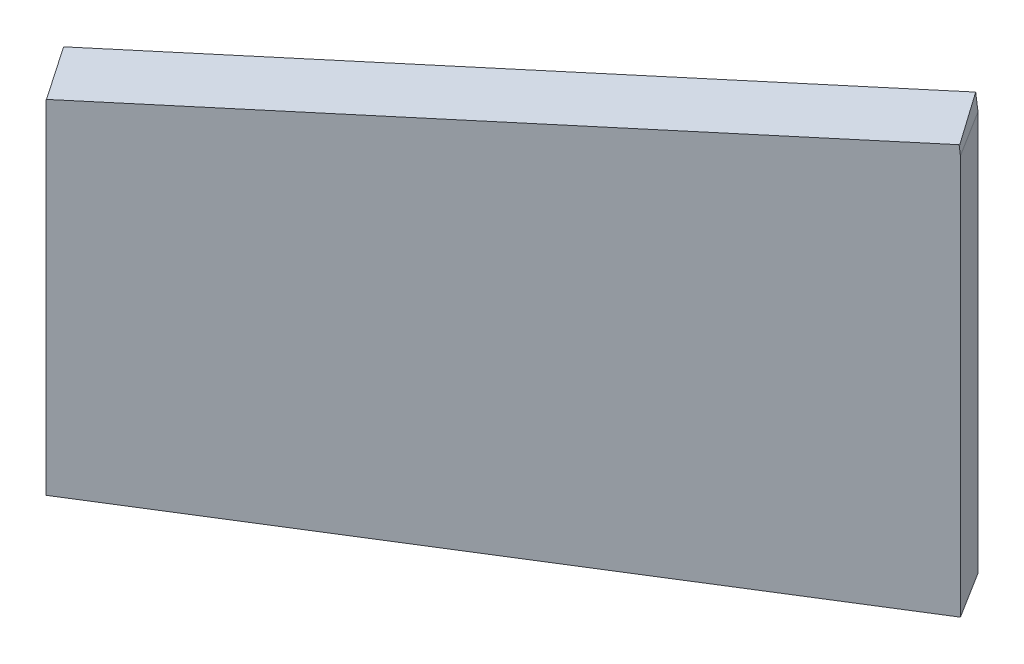
ISO-10303-21;
HEADER;
FILE_DESCRIPTION(('STEP AP214'),'2;1');
FILE_NAME('part.step','',(''),(''),'','','');
FILE_SCHEMA(('AUTOMOTIVE_DESIGN { 1 0 10303 214 1 1 1 1 }'));
ENDSEC;
DATA;
#1=APPLICATION_CONTEXT('core data for automotive mechanical design processes');
#2=APPLICATION_PROTOCOL_DEFINITION('international standard','automotive_design',2000,#1);
#3=PRODUCT_CONTEXT('',#1,'mechanical');
#4=PRODUCT('Part','Part','',(#3));
#5=PRODUCT_RELATED_PRODUCT_CATEGORY('part','',(#4));
#6=PRODUCT_DEFINITION_FORMATION('','',#4);
#7=PRODUCT_DEFINITION_CONTEXT('part definition',#1,'design');
#8=PRODUCT_DEFINITION('design','',#6,#7);
#9=PRODUCT_DEFINITION_SHAPE('','',#8);
#10=(LENGTH_UNIT() NAMED_UNIT(*) SI_UNIT(.MILLI.,.METRE.));
#11=(NAMED_UNIT(*) PLANE_ANGLE_UNIT() SI_UNIT($,.RADIAN.));
#12=(NAMED_UNIT(*) SI_UNIT($,.STERADIAN.) SOLID_ANGLE_UNIT());
#13=UNCERTAINTY_MEASURE_WITH_UNIT(LENGTH_MEASURE(1.E-05),#10,'distance_accuracy_value','');
#14=(GEOMETRIC_REPRESENTATION_CONTEXT(3) GLOBAL_UNCERTAINTY_ASSIGNED_CONTEXT((#13)) GLOBAL_UNIT_ASSIGNED_CONTEXT((#10,
#11,#12)) REPRESENTATION_CONTEXT('',''));
#15=CARTESIAN_POINT('',(0.,0.,0.));
#16=DIRECTION('',(0.,0.,1.));
#17=DIRECTION('',(1.,0.,0.));
#18=AXIS2_PLACEMENT_3D('',#15,#16,#17);
#19=CARTESIAN_POINT('',(352.532153808327,100.844628011332,171.663434087954));
#20=DIRECTION('',(0.84804809615643,0.,-0.529919264233199));
#21=DIRECTION('',(0.529919264233198,0.,0.84804809615643));
#22=AXIS2_PLACEMENT_3D('',#19,#20,#21);
#23=PLANE('',#22);
#24=DIRECTION('',(0.,1.,0.));
#25=VECTOR('',#24,1.);
#26=CARTESIAN_POINT('',(352.026161417626,4.,170.853676993683));
#27=LINE('',#26,#25);
#28=CARTESIAN_POINT('',(352.026161417626,4.1,170.853676993683));
#29=VERTEX_POINT('',#28);
#30=CARTESIAN_POINT('',(352.026161417626,33.0054288937195,170.853676993683));
#31=VERTEX_POINT('',#30);
#32=EDGE_CURVE('E94',#29,#31,#27,.T.);
#33=ORIENTED_EDGE('',*,*,#32,.F.);
#34=DIRECTION('',(0.5299192642332,0.,0.848048096156429));
#35=VECTOR('',#34,1.);
#36=CARTESIAN_POINT('',(349.906484360694,4.1,167.461484609058));
#37=LINE('',#36,#35);
#38=CARTESIAN_POINT('',(349.906484360694,4.10000000000001,167.461484609058));
#39=VERTEX_POINT('',#38);
#40=EDGE_CURVE('E120',#39,#29,#37,.T.);
#41=ORIENTED_EDGE('',*,*,#40,.F.);
#42=DIRECTION('',(0.,1.,0.));
#43=VECTOR('',#42,1.);
#44=CARTESIAN_POINT('',(349.906484360694,114.,167.461484609058));
#45=LINE('',#44,#43);
#46=CARTESIAN_POINT('',(349.906484360694,33.0054288937192,167.461484609058));
#47=VERTEX_POINT('',#46);
#48=EDGE_CURVE('E100',#39,#47,#45,.T.);
#49=ORIENTED_EDGE('',*,*,#48,.T.);
#50=DIRECTION('',(-0.529919264233198,0.,-0.84804809615643));
#51=VECTOR('',#50,1.);
#52=CARTESIAN_POINT('',(352.532153808328,33.0054288937193,171.663434087955));
#53=LINE('',#52,#51);
#54=EDGE_CURVE('E106',#31,#47,#53,.T.);
#55=ORIENTED_EDGE('',*,*,#54,.F.);
#56=EDGE_LOOP('',(#33,#41,#49,#55));
#57=FACE_BOUND('',#56,.T.);
#58=ADVANCED_FACE('F34',(#57),#23,.T.);
#59=CARTESIAN_POINT('',(337.756398159835,31.9209657673548,179.751903546414));
#60=DIRECTION('',(0.536572108572931,-0.156207302919462,0.829270553448165));
#61=DIRECTION('',(-0.83957695434241,0.,0.543240773264603));
#62=AXIS2_PLACEMENT_3D('',#59,#60,#61);
#63=PLANE('',#62);
#64=DIRECTION('',(0.,-0.982717494039836,-0.185111660648554));
#65=VECTOR('',#64,1.);
#66=CARTESIAN_POINT('',(351.968040655547,33.5937448448043,170.871483710548));
#67=LINE('',#66,#65);
#68=CARTESIAN_POINT('',(351.968040655549,33.6920165942078,170.889994876615));
#69=VERTEX_POINT('',#68);
#70=CARTESIAN_POINT('',(351.968040655548,33.5937448448041,170.871483710549));
#71=VERTEX_POINT('',#70);
#72=EDGE_CURVE('E99',#69,#71,#67,.T.);
#73=ORIENTED_EDGE('',*,*,#72,.T.);
#74=DIRECTION('',(-0.843854473414549,-0.0993257540756062,0.527298797908328));
#75=VECTOR('',#74,1.);
#76=CARTESIAN_POINT('',(367.088643455367,35.3735129475818,161.42308243855));
#77=LINE('',#76,#75);
#78=CARTESIAN_POINT('',(311.305069217715,28.8075163797519,196.28052831962));
#79=VERTEX_POINT('',#78);
#80=EDGE_CURVE('E101',#71,#79,#77,.T.);
#81=ORIENTED_EDGE('',*,*,#80,.T.);
#82=DIRECTION('',(0.0827873235379938,0.987721288932465,0.132487412424746));
#83=VECTOR('',#82,1.);
#84=CARTESIAN_POINT('',(311.559658470854,31.8449768810779,196.68795629214));
#85=LINE('',#84,#83);
#86=CARTESIAN_POINT('',(311.313388080638,28.9067672995373,196.293841283198));
#87=VERTEX_POINT('',#86);
#88=EDGE_CURVE('E42',#79,#87,#85,.T.);
#89=ORIENTED_EDGE('',*,*,#88,.T.);
#90=DIRECTION('',(0.843854473414548,0.0993257540756063,-0.527298797908328));
#91=VECTOR('',#90,1.);
#92=CARTESIAN_POINT('',(356.835736524395,34.2649679478073,167.848320913757));
#93=LINE('',#92,#91);
#94=EDGE_CURVE('E91',#87,#69,#93,.T.);
#95=ORIENTED_EDGE('',*,*,#94,.T.);
#96=EDGE_LOOP('',(#73,#81,#89,#95));
#97=FACE_BOUND('',#96,.T.);
#98=ADVANCED_FACE('F97',(#97),#63,.F.);
#99=CARTESIAN_POINT('',(99.9943656155857,35.6903819791565,159.740893755476));
#100=DIRECTION('',(0.,0.982717494039836,0.185111660648554));
#101=DIRECTION('',(0.,-0.185111660648554,0.982717494039836));
#102=AXIS2_PLACEMENT_3D('',#99,#100,#101);
#103=PLANE('',#102);
#104=DIRECTION('',(-0.843854473414548,-0.0993257540756063,0.527298797908328));
#105=VECTOR('',#104,1.);
#106=CARTESIAN_POINT('',(363.89084468236,35.8821034086645,158.723086437992));
#107=LINE('',#106,#105);
#108=CARTESIAN_POINT('',(349.803335804296,34.2239354585693,167.525938980644));
#109=VERTEX_POINT('',#108);
#110=CARTESIAN_POINT('',(309.193711023705,29.4439861531657,192.901648898573));
#111=VERTEX_POINT('',#110);
#112=EDGE_CURVE('E125',#109,#111,#107,.T.);
#113=ORIENTED_EDGE('',*,*,#112,.T.);
#114=DIRECTION('',(-0.523284665044906,0.157744371910458,-0.837430517989054));
#115=VECTOR('',#114,1.);
#116=CARTESIAN_POINT('',(236.862179809988,51.2483552142203,77.1470019588491));
#117=LINE('',#116,#115);
#118=EDGE_CURVE('E55',#79,#111,#117,.T.);
#119=ORIENTED_EDGE('',*,*,#118,.F.);
#120=ORIENTED_EDGE('',*,*,#80,.F.);
#121=DIRECTION('',(0.536572108572795,-0.156207302919478,0.82927055344825));
#122=VECTOR('',#121,1.);
#123=CARTESIAN_POINT('',(274.293955235882,56.2062869361476,50.826422151382));
#124=LINE('',#123,#122);
#125=EDGE_CURVE('E105',#109,#71,#124,.T.);
#126=ORIENTED_EDGE('',*,*,#125,.F.);
#127=EDGE_LOOP('',(#113,#119,#120,#126));
#128=FACE_BOUND('',#127,.T.);
#129=ADVANCED_FACE('F133',(#128),#103,.T.);
#130=CARTESIAN_POINT('',(357.278038075775,114.,162.85522661655));
#131=DIRECTION('',(-0.529919264233199,0.,-0.84804809615643));
#132=DIRECTION('',(0.84804809615643,0.,-0.529919264233199));
#133=AXIS2_PLACEMENT_3D('',#130,#131,#132);
#134=PLANE('',#133);
#135=ORIENTED_EDGE('',*,*,#48,.F.);
#136=DIRECTION('',(0.84804809615643,0.,-0.529919264233199));
#137=VECTOR('',#136,1.);
#138=CARTESIAN_POINT('',(357.278038075775,4.1,162.85522661655));
#139=LINE('',#138,#137);
#140=CARTESIAN_POINT('',(309.193711023705,4.1,192.901648898573));
#141=VERTEX_POINT('',#140);
#142=EDGE_CURVE('E128',#141,#39,#139,.T.);
#143=ORIENTED_EDGE('',*,*,#142,.F.);
#144=DIRECTION('',(0.,1.,0.));
#145=VECTOR('',#144,1.);
#146=CARTESIAN_POINT('',(309.193711023705,4.1,192.901648898573));
#147=LINE('',#146,#145);
#148=EDGE_CURVE('E114',#141,#111,#147,.T.);
#149=ORIENTED_EDGE('',*,*,#148,.T.);
#150=ORIENTED_EDGE('',*,*,#112,.F.);
#151=DIRECTION('',(-0.0842330166431197,0.995054970630926,0.052634630519153));
#152=VECTOR('',#151,1.);
#153=CARTESIAN_POINT('',(343.190529197711,112.341832049905,171.658079159203));
#154=LINE('',#153,#152);
#155=EDGE_CURVE('E108',#47,#109,#154,.T.);
#156=ORIENTED_EDGE('',*,*,#155,.F.);
#157=EDGE_LOOP('',(#135,#143,#149,#150,#156));
#158=FACE_BOUND('',#157,.T.);
#159=ADVANCED_FACE('F136',(#158),#134,.T.);
#160=CARTESIAN_POINT('',(359.397715132708,4.,166.247419001176));
#161=DIRECTION('',(-0.529919264233199,0.,-0.84804809615643));
#162=DIRECTION('',(0.84804809615643,0.,-0.529919264233199));
#163=AXIS2_PLACEMENT_3D('',#160,#161,#162);
#164=PLANE('',#163);
#165=DIRECTION('',(-0.0842330166431197,0.995054970630926,0.052634630519153));
#166=VECTOR('',#165,1.);
#167=CARTESIAN_POINT('',(354.530019263861,3.42704864640043,169.289092964034));
#168=LINE('',#167,#166);
#169=EDGE_CURVE('E11',#31,#69,#168,.T.);
#170=ORIENTED_EDGE('',*,*,#169,.T.);
#171=ORIENTED_EDGE('',*,*,#94,.F.);
#172=DIRECTION('',(0.,1.,0.));
#173=VECTOR('',#172,1.);
#174=CARTESIAN_POINT('',(311.313388080638,4.1,196.293841283198));
#175=LINE('',#174,#173);
#176=CARTESIAN_POINT('',(311.313388080638,4.1,196.293841283198));
#177=VERTEX_POINT('',#176);
#178=EDGE_CURVE('E113',#177,#87,#175,.T.);
#179=ORIENTED_EDGE('',*,*,#178,.F.);
#180=DIRECTION('',(0.848048096156345,0.,-0.529919264233334));
#181=VECTOR('',#180,1.);
#182=CARTESIAN_POINT('',(311.110015040684,4.1,196.420922862876));
#183=LINE('',#182,#181);
#184=EDGE_CURVE('E126',#177,#29,#183,.T.);
#185=ORIENTED_EDGE('',*,*,#184,.T.);
#186=ORIENTED_EDGE('',*,*,#32,.T.);
#187=EDGE_LOOP('',(#170,#171,#179,#185,#186));
#188=FACE_BOUND('',#187,.T.);
#189=ADVANCED_FACE('F89',(#188),#164,.F.);
#190=CARTESIAN_POINT('',(99.9943656155856,4.1,159.759404921541));
#191=DIRECTION('',(0.,-1.,0.));
#192=DIRECTION('',(0.,0.,-1.));
#193=AXIS2_PLACEMENT_3D('',#190,#191,#192);
#194=PLANE('',#193);
#195=ORIENTED_EDGE('',*,*,#142,.T.);
#196=ORIENTED_EDGE('',*,*,#40,.T.);
#197=ORIENTED_EDGE('',*,*,#184,.F.);
#198=DIRECTION('',(0.5299192642332,0.,0.848048096156429));
#199=VECTOR('',#198,1.);
#200=CARTESIAN_POINT('',(309.193711023705,4.1,192.901648898573));
#201=LINE('',#200,#199);
#202=EDGE_CURVE('E116',#141,#177,#201,.T.);
#203=ORIENTED_EDGE('',*,*,#202,.F.);
#204=EDGE_LOOP('',(#195,#196,#197,#203));
#205=FACE_BOUND('',#204,.T.);
#206=ADVANCED_FACE('F36',(#205),#194,.T.);
#207=CARTESIAN_POINT('',(309.193711023705,4.1,192.901648898573));
#208=DIRECTION('',(-0.848048096156429,0.,0.5299192642332));
#209=DIRECTION('',(-0.5299192642332,0.,-0.848048096156429));
#210=AXIS2_PLACEMENT_3D('',#207,#208,#209);
#211=PLANE('',#210);
#212=ORIENTED_EDGE('',*,*,#88,.F.);
#213=ORIENTED_EDGE('',*,*,#118,.T.);
#214=ORIENTED_EDGE('',*,*,#148,.F.);
#215=ORIENTED_EDGE('',*,*,#202,.T.);
#216=ORIENTED_EDGE('',*,*,#178,.T.);
#217=EDGE_LOOP('',(#212,#213,#214,#215,#216));
#218=FACE_BOUND('',#217,.T.);
#219=ADVANCED_FACE('F140',(#218),#211,.T.);
#220=CARTESIAN_POINT('',(362.878961131137,32.3827839065392,188.104501271168));
#221=DIRECTION('',(0.843854473414548,0.0993257540756063,-0.527298797908327));
#222=DIRECTION('',(0.529919264233199,0.,0.84804809615643));
#223=AXIS2_PLACEMENT_3D('',#220,#221,#222);
#224=PLANE('',#223);
#225=ORIENTED_EDGE('',*,*,#155,.T.);
#226=ORIENTED_EDGE('',*,*,#125,.T.);
#227=ORIENTED_EDGE('',*,*,#72,.F.);
#228=ORIENTED_EDGE('',*,*,#169,.F.);
#229=ORIENTED_EDGE('',*,*,#54,.T.);
#230=EDGE_LOOP('',(#225,#226,#227,#228,#229));
#231=FACE_BOUND('',#230,.T.);
#232=ADVANCED_FACE('F103',(#231),#224,.T.);
#233=CLOSED_SHELL('',(#58,#98,#129,#159,#189,#206,#219,#232));
#234=MANIFOLD_SOLID_BREP('B2',#233);
#235=ADVANCED_BREP_SHAPE_REPRESENTATION('',(#18,#234),#14);
#236=SHAPE_DEFINITION_REPRESENTATION(#9,#235);
ENDSEC;
END-ISO-10303-21;
